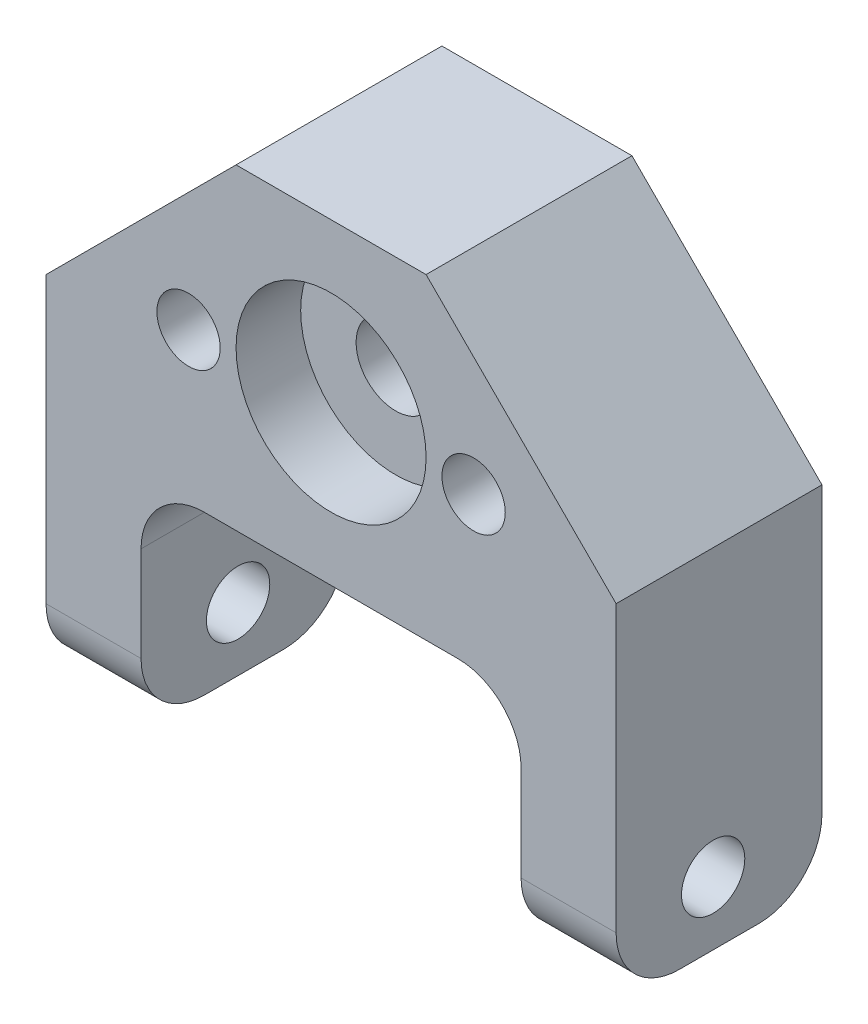
ISO-10303-21;
HEADER;
FILE_DESCRIPTION(('STEP AP214'),'2;1');
FILE_NAME('part.step','',(''),(''),'','','');
FILE_SCHEMA(('AUTOMOTIVE_DESIGN { 1 0 10303 214 1 1 1 1 }'));
ENDSEC;
DATA;
#1=APPLICATION_CONTEXT('core data for automotive mechanical design processes');
#2=APPLICATION_PROTOCOL_DEFINITION('international standard','automotive_design',2000,#1);
#3=PRODUCT_CONTEXT('',#1,'mechanical');
#4=PRODUCT('Part','Part','',(#3));
#5=PRODUCT_RELATED_PRODUCT_CATEGORY('part','',(#4));
#6=PRODUCT_DEFINITION_FORMATION('','',#4);
#7=PRODUCT_DEFINITION_CONTEXT('part definition',#1,'design');
#8=PRODUCT_DEFINITION('design','',#6,#7);
#9=PRODUCT_DEFINITION_SHAPE('','',#8);
#10=(LENGTH_UNIT() NAMED_UNIT(*) SI_UNIT(.MILLI.,.METRE.));
#11=(NAMED_UNIT(*) PLANE_ANGLE_UNIT() SI_UNIT($,.RADIAN.));
#12=(NAMED_UNIT(*) SI_UNIT($,.STERADIAN.) SOLID_ANGLE_UNIT());
#13=UNCERTAINTY_MEASURE_WITH_UNIT(LENGTH_MEASURE(1.E-05),#10,'distance_accuracy_value','');
#14=(GEOMETRIC_REPRESENTATION_CONTEXT(3) GLOBAL_UNCERTAINTY_ASSIGNED_CONTEXT((#13)) GLOBAL_UNIT_ASSIGNED_CONTEXT((#10,
#11,#12)) REPRESENTATION_CONTEXT('',''));
#15=CARTESIAN_POINT('',(0.,0.,0.));
#16=DIRECTION('',(0.,0.,1.));
#17=DIRECTION('',(1.,0.,0.));
#18=AXIS2_PLACEMENT_3D('',#15,#16,#17);
#19=CARTESIAN_POINT('',(28.575,-15.875,20.6375));
#20=DIRECTION('',(0.,1.,0.));
#21=DIRECTION('',(0.,0.,1.));
#22=AXIS2_PLACEMENT_3D('',#19,#20,#21);
#23=PLANE('',#22);
#24=DIRECTION('',(1.,0.,0.));
#25=VECTOR('',#24,1.);
#26=CARTESIAN_POINT('',(28.575,-15.875,0.));
#27=LINE('',#26,#25);
#28=CARTESIAN_POINT('',(-12.7,-15.875,0.));
#29=VERTEX_POINT('',#28);
#30=CARTESIAN_POINT('',(12.7,-15.875,0.));
#31=VERTEX_POINT('',#30);
#32=EDGE_CURVE('E241',#29,#31,#27,.T.);
#33=ORIENTED_EDGE('',*,*,#32,.T.);
#34=DIRECTION('',(0.,0.,-1.));
#35=VECTOR('',#34,1.);
#36=CARTESIAN_POINT('',(12.7,-15.875,20.6375));
#37=LINE('',#36,#35);
#38=CARTESIAN_POINT('',(12.7,-15.875,20.6375));
#39=VERTEX_POINT('',#38);
#40=EDGE_CURVE('E256',#31,#39,#37,.F.);
#41=ORIENTED_EDGE('',*,*,#40,.T.);
#42=DIRECTION('',(1.,0.,0.));
#43=VECTOR('',#42,1.);
#44=CARTESIAN_POINT('',(28.575,-15.875,20.6375));
#45=LINE('',#44,#43);
#46=CARTESIAN_POINT('',(-12.7,-15.875,20.6375));
#47=VERTEX_POINT('',#46);
#48=EDGE_CURVE('E231',#47,#39,#45,.T.);
#49=ORIENTED_EDGE('',*,*,#48,.F.);
#50=DIRECTION('',(0.,0.,1.));
#51=VECTOR('',#50,1.);
#52=CARTESIAN_POINT('',(-12.7,-15.875,0.));
#53=LINE('',#52,#51);
#54=EDGE_CURVE('E254',#47,#29,#53,.F.);
#55=ORIENTED_EDGE('',*,*,#54,.T.);
#56=EDGE_LOOP('',(#33,#41,#49,#55));
#57=FACE_BOUND('',#56,.T.);
#58=ADVANCED_FACE('F35',(#57),#23,.F.);
#59=CARTESIAN_POINT('',(-28.575,-15.875,20.6375));
#60=DIRECTION('',(1.,0.,0.));
#61=DIRECTION('',(0.,0.,-1.));
#62=AXIS2_PLACEMENT_3D('',#59,#60,#61);
#63=PLANE('',#62);
#64=CARTESIAN_POINT('',(-28.575,-31.75,10.9095205986023));
#65=DIRECTION('',(1.,0.,0.));
#66=DIRECTION('',(0.,0.,-1.));
#67=AXIS2_PLACEMENT_3D('',#64,#65,#66);
#68=CIRCLE('',#67,3.175);
#69=CARTESIAN_POINT('',(-28.575,-31.75,7.73452059860228));
#70=VERTEX_POINT('',#69);
#71=EDGE_CURVE('E177',#70,#70,#68,.T.);
#72=ORIENTED_EDGE('',*,*,#71,.T.);
#73=EDGE_LOOP('',(#72));
#74=FACE_BOUND('',#73,.T.);
#75=DIRECTION('',(0.,-1.,0.));
#76=VECTOR('',#75,1.);
#77=CARTESIAN_POINT('',(-28.575,-15.875,20.6375));
#78=LINE('',#77,#76);
#79=CARTESIAN_POINT('',(-28.575,-3.17500000000001,20.6375));
#80=VERTEX_POINT('',#79);
#81=CARTESIAN_POINT('',(-28.575,-31.75,20.6375));
#82=VERTEX_POINT('',#81);
#83=EDGE_CURVE('E229',#80,#82,#78,.T.);
#84=ORIENTED_EDGE('',*,*,#83,.F.);
#85=DIRECTION('',(0.,0.,-1.));
#86=VECTOR('',#85,1.);
#87=CARTESIAN_POINT('',(-28.575,-3.17500000000001,20.6375));
#88=LINE('',#87,#86);
#89=CARTESIAN_POINT('',(-28.575,-3.17500000000001,0.));
#90=VERTEX_POINT('',#89);
#91=EDGE_CURVE('E11',#80,#90,#88,.T.);
#92=ORIENTED_EDGE('',*,*,#91,.T.);
#93=DIRECTION('',(0.,-1.,0.));
#94=VECTOR('',#93,1.);
#95=CARTESIAN_POINT('',(-28.575,-15.875,0.));
#96=LINE('',#95,#94);
#97=CARTESIAN_POINT('',(-28.575,-31.75,0.));
#98=VERTEX_POINT('',#97);
#99=EDGE_CURVE('E226',#90,#98,#96,.T.);
#100=ORIENTED_EDGE('',*,*,#99,.T.);
#101=CARTESIAN_POINT('',(-28.575,-31.75,6.35));
#102=DIRECTION('',(1.,0.,0.));
#103=DIRECTION('',(0.,0.,-1.));
#104=AXIS2_PLACEMENT_3D('',#101,#102,#103);
#105=CIRCLE('',#104,6.35);
#106=CARTESIAN_POINT('',(-28.575,-38.1,6.35));
#107=VERTEX_POINT('',#106);
#108=EDGE_CURVE('E300',#98,#107,#105,.F.);
#109=ORIENTED_EDGE('',*,*,#108,.T.);
#110=DIRECTION('',(0.,0.,-1.));
#111=VECTOR('',#110,1.);
#112=CARTESIAN_POINT('',(-28.575,-38.1,20.6375));
#113=LINE('',#112,#111);
#114=CARTESIAN_POINT('',(-28.575,-38.1,14.2875));
#115=VERTEX_POINT('',#114);
#116=EDGE_CURVE('E196',#115,#107,#113,.T.);
#117=ORIENTED_EDGE('',*,*,#116,.F.);
#118=CARTESIAN_POINT('',(-28.575,-31.75,14.2875));
#119=DIRECTION('',(1.,0.,0.));
#120=DIRECTION('',(0.,0.,-1.));
#121=AXIS2_PLACEMENT_3D('',#118,#119,#120);
#122=CIRCLE('',#121,6.35);
#123=EDGE_CURVE('E302',#115,#82,#122,.F.);
#124=ORIENTED_EDGE('',*,*,#123,.T.);
#125=EDGE_LOOP('',(#84,#92,#100,#109,#117,#124));
#126=FACE_BOUND('',#125,.T.);
#127=ADVANCED_FACE('F376',(#74,#126),#63,.F.);
#128=CARTESIAN_POINT('',(28.575,-15.875,20.6375));
#129=DIRECTION('',(-1.,0.,0.));
#130=DIRECTION('',(0.,0.,1.));
#131=AXIS2_PLACEMENT_3D('',#128,#129,#130);
#132=PLANE('',#131);
#133=CARTESIAN_POINT('',(28.575,-31.75,10.9095205986023));
#134=DIRECTION('',(1.,0.,0.));
#135=DIRECTION('',(0.,0.,-1.));
#136=AXIS2_PLACEMENT_3D('',#133,#134,#135);
#137=CIRCLE('',#136,3.175);
#138=CARTESIAN_POINT('',(28.575,-31.75,7.73452059860228));
#139=VERTEX_POINT('',#138);
#140=EDGE_CURVE('E176',#139,#139,#137,.T.);
#141=ORIENTED_EDGE('',*,*,#140,.F.);
#142=EDGE_LOOP('',(#141));
#143=FACE_BOUND('',#142,.T.);
#144=DIRECTION('',(0.,1.,0.));
#145=VECTOR('',#144,1.);
#146=CARTESIAN_POINT('',(28.575,-15.875,0.));
#147=LINE('',#146,#145);
#148=CARTESIAN_POINT('',(28.575,-31.75,0.));
#149=VERTEX_POINT('',#148);
#150=CARTESIAN_POINT('',(28.575,-3.17500000000007,0.));
#151=VERTEX_POINT('',#150);
#152=EDGE_CURVE('E244',#149,#151,#147,.T.);
#153=ORIENTED_EDGE('',*,*,#152,.T.);
#154=DIRECTION('',(0.,0.,1.));
#155=VECTOR('',#154,1.);
#156=CARTESIAN_POINT('',(28.575,-3.17500000000007,20.6375));
#157=LINE('',#156,#155);
#158=CARTESIAN_POINT('',(28.575,-3.17500000000007,20.6375));
#159=VERTEX_POINT('',#158);
#160=EDGE_CURVE('E58',#151,#159,#157,.T.);
#161=ORIENTED_EDGE('',*,*,#160,.T.);
#162=DIRECTION('',(0.,1.,0.));
#163=VECTOR('',#162,1.);
#164=CARTESIAN_POINT('',(28.575,-15.875,20.6375));
#165=LINE('',#164,#163);
#166=CARTESIAN_POINT('',(28.575,-31.75,20.6375));
#167=VERTEX_POINT('',#166);
#168=EDGE_CURVE('E235',#167,#159,#165,.T.);
#169=ORIENTED_EDGE('',*,*,#168,.F.);
#170=CARTESIAN_POINT('',(28.575,-31.75,14.2875));
#171=DIRECTION('',(-1.,0.,0.));
#172=DIRECTION('',(0.,0.,1.));
#173=AXIS2_PLACEMENT_3D('',#170,#171,#172);
#174=CIRCLE('',#173,6.35);
#175=CARTESIAN_POINT('',(28.575,-38.1,14.2875));
#176=VERTEX_POINT('',#175);
#177=EDGE_CURVE('E277',#167,#176,#174,.F.);
#178=ORIENTED_EDGE('',*,*,#177,.T.);
#179=DIRECTION('',(0.,0.,1.));
#180=VECTOR('',#179,1.);
#181=CARTESIAN_POINT('',(28.575,-38.1,20.6375));
#182=LINE('',#181,#180);
#183=CARTESIAN_POINT('',(28.575,-38.1,6.35));
#184=VERTEX_POINT('',#183);
#185=EDGE_CURVE('E186',#184,#176,#182,.T.);
#186=ORIENTED_EDGE('',*,*,#185,.F.);
#187=CARTESIAN_POINT('',(28.575,-31.75,6.35));
#188=DIRECTION('',(-1.,0.,0.));
#189=DIRECTION('',(0.,0.,1.));
#190=AXIS2_PLACEMENT_3D('',#187,#188,#189);
#191=CIRCLE('',#190,6.35);
#192=EDGE_CURVE('E279',#184,#149,#191,.F.);
#193=ORIENTED_EDGE('',*,*,#192,.T.);
#194=EDGE_LOOP('',(#153,#161,#169,#178,#186,#193));
#195=FACE_BOUND('',#194,.T.);
#196=ADVANCED_FACE('F333',(#143,#195),#132,.F.);
#197=CARTESIAN_POINT('',(28.575,15.875,20.6375));
#198=DIRECTION('',(0.,-1.,0.));
#199=DIRECTION('',(0.,0.,-1.));
#200=AXIS2_PLACEMENT_3D('',#197,#198,#199);
#201=PLANE('',#200);
#202=DIRECTION('',(-1.,0.,0.));
#203=VECTOR('',#202,1.);
#204=CARTESIAN_POINT('',(28.575,15.875,20.6375));
#205=LINE('',#204,#203);
#206=CARTESIAN_POINT('',(9.52500000000003,15.875,20.6375));
#207=VERTEX_POINT('',#206);
#208=CARTESIAN_POINT('',(-9.52499999999989,15.875,20.6375));
#209=VERTEX_POINT('',#208);
#210=EDGE_CURVE('E237',#207,#209,#205,.T.);
#211=ORIENTED_EDGE('',*,*,#210,.F.);
#212=DIRECTION('',(0.,0.,-1.));
#213=VECTOR('',#212,1.);
#214=CARTESIAN_POINT('',(9.52500000000003,15.875,20.6375));
#215=LINE('',#214,#213);
#216=CARTESIAN_POINT('',(9.52500000000003,15.875,0.));
#217=VERTEX_POINT('',#216);
#218=EDGE_CURVE('E311',#207,#217,#215,.T.);
#219=ORIENTED_EDGE('',*,*,#218,.T.);
#220=DIRECTION('',(-1.,0.,0.));
#221=VECTOR('',#220,1.);
#222=CARTESIAN_POINT('',(28.575,15.875,0.));
#223=LINE('',#222,#221);
#224=CARTESIAN_POINT('',(-9.52499999999989,15.875,0.));
#225=VERTEX_POINT('',#224);
#226=EDGE_CURVE('E232',#217,#225,#223,.T.);
#227=ORIENTED_EDGE('',*,*,#226,.T.);
#228=DIRECTION('',(0.,0.,1.));
#229=VECTOR('',#228,1.);
#230=CARTESIAN_POINT('',(-9.52499999999989,15.875,20.6375));
#231=LINE('',#230,#229);
#232=EDGE_CURVE('E309',#225,#209,#231,.T.);
#233=ORIENTED_EDGE('',*,*,#232,.T.);
#234=EDGE_LOOP('',(#211,#219,#227,#233));
#235=FACE_BOUND('',#234,.T.);
#236=ADVANCED_FACE('F325',(#235),#201,.F.);
#237=CARTESIAN_POINT('',(0.,0.,20.6375));
#238=DIRECTION('',(0.,0.,1.));
#239=DIRECTION('',(1.,0.,0.));
#240=AXIS2_PLACEMENT_3D('',#237,#238,#239);
#241=PLANE('',#240);
#242=CARTESIAN_POINT('',(-14.2875728668612,-0.825499999999172,20.6375));
#243=DIRECTION('',(0.,0.,1.));
#244=DIRECTION('',(1.,0.,0.));
#245=AXIS2_PLACEMENT_3D('',#242,#243,#244);
#246=CIRCLE('',#245,3.17499999999999);
#247=CARTESIAN_POINT('',(-11.1125728668612,-0.825499999999172,20.6375));
#248=VERTEX_POINT('',#247);
#249=EDGE_CURVE('E166',#248,#248,#246,.T.);
#250=ORIENTED_EDGE('',*,*,#249,.F.);
#251=EDGE_LOOP('',(#250));
#252=FACE_BOUND('',#251,.T.);
#253=CARTESIAN_POINT('',(14.2874270219863,-0.828020390614769,20.6375));
#254=DIRECTION('',(0.,0.,1.));
#255=DIRECTION('',(1.,0.,0.));
#256=AXIS2_PLACEMENT_3D('',#253,#254,#255);
#257=CIRCLE('',#256,3.17499999999999);
#258=CARTESIAN_POINT('',(17.4624270219863,-0.828020390614769,20.6375));
#259=VERTEX_POINT('',#258);
#260=EDGE_CURVE('E165',#259,#259,#257,.T.);
#261=ORIENTED_EDGE('',*,*,#260,.F.);
#262=EDGE_LOOP('',(#261));
#263=FACE_BOUND('',#262,.T.);
#264=CARTESIAN_POINT('',(0.,0.,20.6375));
#265=DIRECTION('',(0.,0.,-1.));
#266=DIRECTION('',(-1.,0.,0.));
#267=AXIS2_PLACEMENT_3D('',#264,#265,#266);
#268=CIRCLE('',#267,9.525);
#269=CARTESIAN_POINT('',(-9.525,0.,20.6375));
#270=VERTEX_POINT('',#269);
#271=EDGE_CURVE('E207',#270,#270,#268,.T.);
#272=ORIENTED_EDGE('',*,*,#271,.T.);
#273=EDGE_LOOP('',(#272));
#274=FACE_BOUND('',#273,.T.);
#275=ORIENTED_EDGE('',*,*,#168,.T.);
#276=DIRECTION('',(0.707106781186546,-0.707106781186549,0.));
#277=VECTOR('',#276,1.);
#278=CARTESIAN_POINT('',(12.7,12.7,20.6375));
#279=LINE('',#278,#277);
#280=EDGE_CURVE('E43',#159,#207,#279,.F.);
#281=ORIENTED_EDGE('',*,*,#280,.T.);
#282=ORIENTED_EDGE('',*,*,#210,.T.);
#283=DIRECTION('',(0.707106781186549,0.707106781186546,0.));
#284=VECTOR('',#283,1.);
#285=CARTESIAN_POINT('',(-12.6999999999999,12.7,20.6375));
#286=LINE('',#285,#284);
#287=EDGE_CURVE('E50',#209,#80,#286,.F.);
#288=ORIENTED_EDGE('',*,*,#287,.T.);
#289=ORIENTED_EDGE('',*,*,#83,.T.);
#290=DIRECTION('',(-1.,0.,0.));
#291=VECTOR('',#290,1.);
#292=CARTESIAN_POINT('',(0.,-31.75,20.6375));
#293=LINE('',#292,#291);
#294=CARTESIAN_POINT('',(-19.05,-31.75,20.6375));
#295=VERTEX_POINT('',#294);
#296=EDGE_CURVE('E290',#82,#295,#293,.F.);
#297=ORIENTED_EDGE('',*,*,#296,.T.);
#298=DIRECTION('',(0.,1.,0.));
#299=VECTOR('',#298,1.);
#300=CARTESIAN_POINT('',(-19.05,-38.1,20.6375));
#301=LINE('',#300,#299);
#302=CARTESIAN_POINT('',(-19.05,-22.225,20.6375));
#303=VERTEX_POINT('',#302);
#304=EDGE_CURVE('E202',#295,#303,#301,.T.);
#305=ORIENTED_EDGE('',*,*,#304,.T.);
#306=CARTESIAN_POINT('',(-12.7,-22.225,20.6375));
#307=DIRECTION('',(0.,0.,1.));
#308=DIRECTION('',(1.,0.,0.));
#309=AXIS2_PLACEMENT_3D('',#306,#307,#308);
#310=CIRCLE('',#309,6.35);
#311=EDGE_CURVE('E266',#303,#47,#310,.F.);
#312=ORIENTED_EDGE('',*,*,#311,.T.);
#313=ORIENTED_EDGE('',*,*,#48,.T.);
#314=CARTESIAN_POINT('',(12.7,-22.225,20.6375));
#315=DIRECTION('',(0.,0.,1.));
#316=DIRECTION('',(1.,0.,0.));
#317=AXIS2_PLACEMENT_3D('',#314,#315,#316);
#318=CIRCLE('',#317,6.35);
#319=CARTESIAN_POINT('',(19.05,-22.225,20.6375));
#320=VERTEX_POINT('',#319);
#321=EDGE_CURVE('E263',#39,#320,#318,.F.);
#322=ORIENTED_EDGE('',*,*,#321,.T.);
#323=DIRECTION('',(0.,1.,0.));
#324=VECTOR('',#323,1.);
#325=CARTESIAN_POINT('',(19.05,-38.1,20.6375));
#326=LINE('',#325,#324);
#327=CARTESIAN_POINT('',(19.05,-31.75,20.6375));
#328=VERTEX_POINT('',#327);
#329=EDGE_CURVE('E194',#328,#320,#326,.T.);
#330=ORIENTED_EDGE('',*,*,#329,.F.);
#331=DIRECTION('',(-1.,0.,0.));
#332=VECTOR('',#331,1.);
#333=CARTESIAN_POINT('',(28.575,-31.75,20.6375));
#334=LINE('',#333,#332);
#335=EDGE_CURVE('E292',#328,#167,#334,.F.);
#336=ORIENTED_EDGE('',*,*,#335,.T.);
#337=EDGE_LOOP('',(#275,#281,#282,#288,#289,#297,#305,#312,#313,#322,#330,#336));
#338=FACE_BOUND('',#337,.T.);
#339=ADVANCED_FACE('F321',(#252,#263,#274,#338),#241,.T.);
#340=CARTESIAN_POINT('',(0.,0.,0.));
#341=DIRECTION('',(0.,0.,1.));
#342=DIRECTION('',(1.,0.,0.));
#343=AXIS2_PLACEMENT_3D('',#340,#341,#342);
#344=PLANE('',#343);
#345=CARTESIAN_POINT('',(0.,0.,0.));
#346=DIRECTION('',(0.,0.,-1.));
#347=DIRECTION('',(-1.,0.,0.));
#348=AXIS2_PLACEMENT_3D('',#345,#346,#347);
#349=CIRCLE('',#348,11.1125);
#350=CARTESIAN_POINT('',(-11.1125,0.,0.));
#351=VERTEX_POINT('',#350);
#352=EDGE_CURVE('E220',#351,#351,#349,.T.);
#353=ORIENTED_EDGE('',*,*,#352,.F.);
#354=EDGE_LOOP('',(#353));
#355=FACE_BOUND('',#354,.T.);
#356=ORIENTED_EDGE('',*,*,#226,.F.);
#357=DIRECTION('',(-0.707106781186546,0.707106781186549,0.));
#358=VECTOR('',#357,1.);
#359=CARTESIAN_POINT('',(9.52500000000003,15.875,0.));
#360=LINE('',#359,#358);
#361=EDGE_CURVE('E316',#217,#151,#360,.F.);
#362=ORIENTED_EDGE('',*,*,#361,.T.);
#363=ORIENTED_EDGE('',*,*,#152,.F.);
#364=DIRECTION('',(1.,0.,0.));
#365=VECTOR('',#364,1.);
#366=CARTESIAN_POINT('',(0.,-31.75,0.));
#367=LINE('',#366,#365);
#368=CARTESIAN_POINT('',(19.05,-31.75,0.));
#369=VERTEX_POINT('',#368);
#370=EDGE_CURVE('E284',#149,#369,#367,.F.);
#371=ORIENTED_EDGE('',*,*,#370,.T.);
#372=DIRECTION('',(0.,1.,0.));
#373=VECTOR('',#372,1.);
#374=CARTESIAN_POINT('',(19.05,-38.1,0.));
#375=LINE('',#374,#373);
#376=CARTESIAN_POINT('',(19.05,-22.225,0.));
#377=VERTEX_POINT('',#376);
#378=EDGE_CURVE('E192',#369,#377,#375,.T.);
#379=ORIENTED_EDGE('',*,*,#378,.T.);
#380=CARTESIAN_POINT('',(12.7,-22.225,0.));
#381=DIRECTION('',(0.,0.,1.));
#382=DIRECTION('',(1.,0.,0.));
#383=AXIS2_PLACEMENT_3D('',#380,#381,#382);
#384=CIRCLE('',#383,6.35);
#385=EDGE_CURVE('E261',#377,#31,#384,.T.);
#386=ORIENTED_EDGE('',*,*,#385,.T.);
#387=ORIENTED_EDGE('',*,*,#32,.F.);
#388=CARTESIAN_POINT('',(-12.7,-22.225,0.));
#389=DIRECTION('',(0.,0.,1.));
#390=DIRECTION('',(1.,0.,0.));
#391=AXIS2_PLACEMENT_3D('',#388,#389,#390);
#392=CIRCLE('',#391,6.35);
#393=CARTESIAN_POINT('',(-19.05,-22.225,0.));
#394=VERTEX_POINT('',#393);
#395=EDGE_CURVE('E268',#29,#394,#392,.T.);
#396=ORIENTED_EDGE('',*,*,#395,.T.);
#397=DIRECTION('',(0.,1.,0.));
#398=VECTOR('',#397,1.);
#399=CARTESIAN_POINT('',(-19.05,-38.1,0.));
#400=LINE('',#399,#398);
#401=CARTESIAN_POINT('',(-19.05,-31.75,0.));
#402=VERTEX_POINT('',#401);
#403=EDGE_CURVE('E204',#402,#394,#400,.T.);
#404=ORIENTED_EDGE('',*,*,#403,.F.);
#405=DIRECTION('',(1.,0.,0.));
#406=VECTOR('',#405,1.);
#407=CARTESIAN_POINT('',(-28.575,-31.75,0.));
#408=LINE('',#407,#406);
#409=EDGE_CURVE('E281',#402,#98,#408,.F.);
#410=ORIENTED_EDGE('',*,*,#409,.T.);
#411=ORIENTED_EDGE('',*,*,#99,.F.);
#412=DIRECTION('',(-0.707106781186549,-0.707106781186546,0.));
#413=VECTOR('',#412,1.);
#414=CARTESIAN_POINT('',(-28.575,-3.17500000000001,0.));
#415=LINE('',#414,#413);
#416=EDGE_CURVE('E314',#90,#225,#415,.F.);
#417=ORIENTED_EDGE('',*,*,#416,.T.);
#418=EDGE_LOOP('',(#356,#362,#363,#371,#379,#386,#387,#396,#404,#410,#411,#417));
#419=FACE_BOUND('',#418,.T.);
#420=ADVANCED_FACE('F331',(#355,#419),#344,.F.);
#421=CARTESIAN_POINT('',(0.,0.,6.985));
#422=DIRECTION('',(0.,0.,-1.));
#423=DIRECTION('',(-1.,0.,0.));
#424=AXIS2_PLACEMENT_3D('',#421,#422,#423);
#425=CYLINDRICAL_SURFACE('',#424,11.1125);
#426=CARTESIAN_POINT('',(0.,0.,6.985));
#427=DIRECTION('',(0.,0.,-1.));
#428=DIRECTION('',(-1.,0.,0.));
#429=AXIS2_PLACEMENT_3D('',#426,#427,#428);
#430=CIRCLE('',#429,11.1125);
#431=CARTESIAN_POINT('',(-11.1125,0.,6.985));
#432=VERTEX_POINT('',#431);
#433=EDGE_CURVE('E223',#432,#432,#430,.T.);
#434=ORIENTED_EDGE('',*,*,#433,.F.);
#435=EDGE_LOOP('',(#434));
#436=FACE_BOUND('',#435,.T.);
#437=ORIENTED_EDGE('',*,*,#352,.T.);
#438=EDGE_LOOP('',(#437));
#439=FACE_BOUND('',#438,.T.);
#440=ADVANCED_FACE('F436',(#436,#439),#425,.F.);
#441=CARTESIAN_POINT('',(0.,0.,6.985));
#442=DIRECTION('',(0.,0.,-1.));
#443=DIRECTION('',(-1.,0.,0.));
#444=AXIS2_PLACEMENT_3D('',#441,#442,#443);
#445=PLANE('',#444);
#446=CARTESIAN_POINT('',(0.,0.,6.985));
#447=DIRECTION('',(0.,0.,-1.));
#448=DIRECTION('',(-1.,0.,0.));
#449=AXIS2_PLACEMENT_3D('',#446,#447,#448);
#450=CIRCLE('',#449,8.255);
#451=CARTESIAN_POINT('',(-8.255,0.,6.985));
#452=VERTEX_POINT('',#451);
#453=EDGE_CURVE('E216',#452,#452,#450,.T.);
#454=ORIENTED_EDGE('',*,*,#453,.F.);
#455=EDGE_LOOP('',(#454));
#456=FACE_BOUND('',#455,.T.);
#457=ORIENTED_EDGE('',*,*,#433,.T.);
#458=EDGE_LOOP('',(#457));
#459=FACE_BOUND('',#458,.T.);
#460=ADVANCED_FACE('F529',(#456,#459),#445,.T.);
#461=CARTESIAN_POINT('',(0.,0.,9.398));
#462=DIRECTION('',(0.,0.,-1.));
#463=DIRECTION('',(-1.,0.,0.));
#464=AXIS2_PLACEMENT_3D('',#461,#462,#463);
#465=CYLINDRICAL_SURFACE('',#464,8.255);
#466=CARTESIAN_POINT('',(0.,0.,9.398));
#467=DIRECTION('',(0.,0.,-1.));
#468=DIRECTION('',(-1.,0.,0.));
#469=AXIS2_PLACEMENT_3D('',#466,#467,#468);
#470=CIRCLE('',#469,8.255);
#471=CARTESIAN_POINT('',(-8.255,0.,9.398));
#472=VERTEX_POINT('',#471);
#473=EDGE_CURVE('E217',#472,#472,#470,.T.);
#474=ORIENTED_EDGE('',*,*,#473,.F.);
#475=EDGE_LOOP('',(#474));
#476=FACE_BOUND('',#475,.T.);
#477=ORIENTED_EDGE('',*,*,#453,.T.);
#478=EDGE_LOOP('',(#477));
#479=FACE_BOUND('',#478,.T.);
#480=ADVANCED_FACE('F520',(#476,#479),#465,.F.);
#481=CARTESIAN_POINT('',(0.,0.,9.398));
#482=DIRECTION('',(0.,0.,-1.));
#483=DIRECTION('',(-1.,0.,0.));
#484=AXIS2_PLACEMENT_3D('',#481,#482,#483);
#485=PLANE('',#484);
#486=CARTESIAN_POINT('',(0.,0.,9.398));
#487=DIRECTION('',(0.,0.,-1.));
#488=DIRECTION('',(-1.,0.,0.));
#489=AXIS2_PLACEMENT_3D('',#486,#487,#488);
#490=CIRCLE('',#489,3.96875);
#491=CARTESIAN_POINT('',(-3.96875,0.,9.398));
#492=VERTEX_POINT('',#491);
#493=EDGE_CURVE('E213',#492,#492,#490,.T.);
#494=ORIENTED_EDGE('',*,*,#493,.F.);
#495=EDGE_LOOP('',(#494));
#496=FACE_BOUND('',#495,.T.);
#497=ORIENTED_EDGE('',*,*,#473,.T.);
#498=EDGE_LOOP('',(#497));
#499=FACE_BOUND('',#498,.T.);
#500=ADVANCED_FACE('F511',(#496,#499),#485,.T.);
#501=CARTESIAN_POINT('',(0.,0.,20.6375));
#502=DIRECTION('',(0.,0.,-1.));
#503=DIRECTION('',(-1.,0.,0.));
#504=AXIS2_PLACEMENT_3D('',#501,#502,#503);
#505=CYLINDRICAL_SURFACE('',#504,3.96875);
#506=CARTESIAN_POINT('',(0.,0.,14.1605));
#507=DIRECTION('',(0.,0.,-1.));
#508=DIRECTION('',(-1.,0.,0.));
#509=AXIS2_PLACEMENT_3D('',#506,#507,#508);
#510=CIRCLE('',#509,3.96875);
#511=CARTESIAN_POINT('',(-3.96875,0.,14.1605));
#512=VERTEX_POINT('',#511);
#513=EDGE_CURVE('E210',#512,#512,#510,.F.);
#514=ORIENTED_EDGE('',*,*,#513,.T.);
#515=EDGE_LOOP('',(#514));
#516=FACE_BOUND('',#515,.T.);
#517=ORIENTED_EDGE('',*,*,#493,.T.);
#518=EDGE_LOOP('',(#517));
#519=FACE_BOUND('',#518,.T.);
#520=ADVANCED_FACE('F502',(#516,#519),#505,.F.);
#521=CARTESIAN_POINT('',(0.,0.,14.1605));
#522=DIRECTION('',(0.,0.,-1.));
#523=DIRECTION('',(-1.,0.,0.));
#524=AXIS2_PLACEMENT_3D('',#521,#522,#523);
#525=PLANE('',#524);
#526=CARTESIAN_POINT('',(0.,0.,14.1605));
#527=DIRECTION('',(0.,0.,-1.));
#528=DIRECTION('',(-1.,0.,0.));
#529=AXIS2_PLACEMENT_3D('',#526,#527,#528);
#530=CIRCLE('',#529,9.525);
#531=CARTESIAN_POINT('',(-9.525,0.,14.1605));
#532=VERTEX_POINT('',#531);
#533=EDGE_CURVE('E206',#532,#532,#530,.T.);
#534=ORIENTED_EDGE('',*,*,#533,.F.);
#535=EDGE_LOOP('',(#534));
#536=FACE_BOUND('',#535,.T.);
#537=ORIENTED_EDGE('',*,*,#513,.F.);
#538=EDGE_LOOP('',(#537));
#539=FACE_BOUND('',#538,.T.);
#540=ADVANCED_FACE('F492',(#536,#539),#525,.F.);
#541=CARTESIAN_POINT('',(0.,0.,20.6375));
#542=DIRECTION('',(0.,0.,-1.));
#543=DIRECTION('',(-1.,0.,0.));
#544=AXIS2_PLACEMENT_3D('',#541,#542,#543);
#545=CYLINDRICAL_SURFACE('',#544,9.525);
#546=ORIENTED_EDGE('',*,*,#271,.F.);
#547=EDGE_LOOP('',(#546));
#548=FACE_BOUND('',#547,.T.);
#549=ORIENTED_EDGE('',*,*,#533,.T.);
#550=EDGE_LOOP('',(#549));
#551=FACE_BOUND('',#550,.T.);
#552=ADVANCED_FACE('F486',(#548,#551),#545,.F.);
#553=CARTESIAN_POINT('',(-19.05,-38.1,20.6375));
#554=DIRECTION('',(-1.,0.,0.));
#555=DIRECTION('',(0.,-1.,0.));
#556=AXIS2_PLACEMENT_3D('',#553,#554,#555);
#557=PLANE('',#556);
#558=CARTESIAN_POINT('',(-19.05,-31.75,10.9095205986023));
#559=DIRECTION('',(-1.,0.,0.));
#560=DIRECTION('',(0.,-1.,0.));
#561=AXIS2_PLACEMENT_3D('',#558,#559,#560);
#562=CIRCLE('',#561,3.175);
#563=CARTESIAN_POINT('',(-19.05,-34.925,10.9095205986023));
#564=VERTEX_POINT('',#563);
#565=EDGE_CURVE('E183',#564,#564,#562,.T.);
#566=ORIENTED_EDGE('',*,*,#565,.T.);
#567=EDGE_LOOP('',(#566));
#568=FACE_BOUND('',#567,.T.);
#569=ORIENTED_EDGE('',*,*,#304,.F.);
#570=CARTESIAN_POINT('',(-19.05,-31.75,14.2875));
#571=DIRECTION('',(-1.,0.,0.));
#572=DIRECTION('',(0.,-1.,0.));
#573=AXIS2_PLACEMENT_3D('',#570,#571,#572);
#574=CIRCLE('',#573,6.35);
#575=CARTESIAN_POINT('',(-19.05,-38.1,14.2875));
#576=VERTEX_POINT('',#575);
#577=EDGE_CURVE('E307',#295,#576,#574,.F.);
#578=ORIENTED_EDGE('',*,*,#577,.T.);
#579=DIRECTION('',(0.,0.,1.));
#580=VECTOR('',#579,1.);
#581=CARTESIAN_POINT('',(-19.05,-38.1,20.6375));
#582=LINE('',#581,#580);
#583=CARTESIAN_POINT('',(-19.05,-38.1,6.35));
#584=VERTEX_POINT('',#583);
#585=EDGE_CURVE('E199',#584,#576,#582,.T.);
#586=ORIENTED_EDGE('',*,*,#585,.F.);
#587=CARTESIAN_POINT('',(-19.05,-31.75,6.35));
#588=DIRECTION('',(-1.,0.,0.));
#589=DIRECTION('',(0.,-1.,0.));
#590=AXIS2_PLACEMENT_3D('',#587,#588,#589);
#591=CIRCLE('',#590,6.35);
#592=EDGE_CURVE('E305',#584,#402,#591,.F.);
#593=ORIENTED_EDGE('',*,*,#592,.T.);
#594=ORIENTED_EDGE('',*,*,#403,.T.);
#595=DIRECTION('',(0.,0.,1.));
#596=VECTOR('',#595,1.);
#597=CARTESIAN_POINT('',(-19.05,-22.225,20.6375));
#598=LINE('',#597,#596);
#599=EDGE_CURVE('E258',#394,#303,#598,.T.);
#600=ORIENTED_EDGE('',*,*,#599,.T.);
#601=EDGE_LOOP('',(#569,#578,#586,#593,#594,#600));
#602=FACE_BOUND('',#601,.T.);
#603=ADVANCED_FACE('F364',(#568,#602),#557,.F.);
#604=CARTESIAN_POINT('',(0.,-38.1,0.));
#605=DIRECTION('',(0.,-1.,0.));
#606=DIRECTION('',(1.,0.,0.));
#607=AXIS2_PLACEMENT_3D('',#604,#605,#606);
#608=PLANE('',#607);
#609=ORIENTED_EDGE('',*,*,#585,.T.);
#610=DIRECTION('',(-1.,0.,0.));
#611=VECTOR('',#610,1.);
#612=CARTESIAN_POINT('',(0.,-38.1,14.2875));
#613=LINE('',#612,#611);
#614=EDGE_CURVE('E297',#576,#115,#613,.T.);
#615=ORIENTED_EDGE('',*,*,#614,.T.);
#616=ORIENTED_EDGE('',*,*,#116,.T.);
#617=DIRECTION('',(1.,0.,0.));
#618=VECTOR('',#617,1.);
#619=CARTESIAN_POINT('',(-19.05,-38.1,6.35));
#620=LINE('',#619,#618);
#621=EDGE_CURVE('E294',#107,#584,#620,.T.);
#622=ORIENTED_EDGE('',*,*,#621,.T.);
#623=EDGE_LOOP('',(#609,#615,#616,#622));
#624=FACE_BOUND('',#623,.T.);
#625=ADVANCED_FACE('F378',(#624),#608,.T.);
#626=CARTESIAN_POINT('',(19.05,-38.1,20.6375));
#627=DIRECTION('',(1.,0.,0.));
#628=DIRECTION('',(0.,1.,0.));
#629=AXIS2_PLACEMENT_3D('',#626,#627,#628);
#630=PLANE('',#629);
#631=CARTESIAN_POINT('',(19.05,-31.75,10.9095205986023));
#632=DIRECTION('',(1.,0.,0.));
#633=DIRECTION('',(0.,1.,0.));
#634=AXIS2_PLACEMENT_3D('',#631,#632,#633);
#635=CIRCLE('',#634,3.175);
#636=CARTESIAN_POINT('',(19.05,-28.575,10.9095205986023));
#637=VERTEX_POINT('',#636);
#638=EDGE_CURVE('E180',#637,#637,#635,.T.);
#639=ORIENTED_EDGE('',*,*,#638,.T.);
#640=EDGE_LOOP('',(#639));
#641=FACE_BOUND('',#640,.T.);
#642=ORIENTED_EDGE('',*,*,#378,.F.);
#643=CARTESIAN_POINT('',(19.05,-31.75,6.35));
#644=DIRECTION('',(1.,0.,0.));
#645=DIRECTION('',(0.,1.,0.));
#646=AXIS2_PLACEMENT_3D('',#643,#644,#645);
#647=CIRCLE('',#646,6.35);
#648=CARTESIAN_POINT('',(19.05,-38.1,6.35));
#649=VERTEX_POINT('',#648);
#650=EDGE_CURVE('E288',#369,#649,#647,.F.);
#651=ORIENTED_EDGE('',*,*,#650,.T.);
#652=DIRECTION('',(0.,0.,-1.));
#653=VECTOR('',#652,1.);
#654=CARTESIAN_POINT('',(19.05,-38.1,20.6375));
#655=LINE('',#654,#653);
#656=CARTESIAN_POINT('',(19.05,-38.1,14.2875));
#657=VERTEX_POINT('',#656);
#658=EDGE_CURVE('E189',#657,#649,#655,.T.);
#659=ORIENTED_EDGE('',*,*,#658,.F.);
#660=CARTESIAN_POINT('',(19.05,-31.75,14.2875));
#661=DIRECTION('',(1.,0.,0.));
#662=DIRECTION('',(0.,1.,0.));
#663=AXIS2_PLACEMENT_3D('',#660,#661,#662);
#664=CIRCLE('',#663,6.35);
#665=EDGE_CURVE('E286',#657,#328,#664,.F.);
#666=ORIENTED_EDGE('',*,*,#665,.T.);
#667=ORIENTED_EDGE('',*,*,#329,.T.);
#668=DIRECTION('',(0.,0.,-1.));
#669=VECTOR('',#668,1.);
#670=CARTESIAN_POINT('',(19.05,-22.225,0.));
#671=LINE('',#670,#669);
#672=EDGE_CURVE('E239',#320,#377,#671,.T.);
#673=ORIENTED_EDGE('',*,*,#672,.T.);
#674=EDGE_LOOP('',(#642,#651,#659,#666,#667,#673));
#675=FACE_BOUND('',#674,.T.);
#676=ADVANCED_FACE('F345',(#641,#675),#630,.F.);
#677=CARTESIAN_POINT('',(0.,-38.1,0.));
#678=DIRECTION('',(0.,1.,0.));
#679=DIRECTION('',(-1.,0.,0.));
#680=AXIS2_PLACEMENT_3D('',#677,#678,#679);
#681=PLANE('',#680);
#682=ORIENTED_EDGE('',*,*,#658,.T.);
#683=DIRECTION('',(1.,0.,0.));
#684=VECTOR('',#683,1.);
#685=CARTESIAN_POINT('',(0.,-38.1,6.35));
#686=LINE('',#685,#684);
#687=EDGE_CURVE('E274',#649,#184,#686,.T.);
#688=ORIENTED_EDGE('',*,*,#687,.T.);
#689=ORIENTED_EDGE('',*,*,#185,.T.);
#690=DIRECTION('',(-1.,0.,0.));
#691=VECTOR('',#690,1.);
#692=CARTESIAN_POINT('',(19.05,-38.1,14.2875));
#693=LINE('',#692,#691);
#694=EDGE_CURVE('E271',#176,#657,#693,.T.);
#695=ORIENTED_EDGE('',*,*,#694,.T.);
#696=EDGE_LOOP('',(#682,#688,#689,#695));
#697=FACE_BOUND('',#696,.T.);
#698=ADVANCED_FACE('F340',(#697),#681,.F.);
#699=CARTESIAN_POINT('',(-28.575,-31.75,10.9095205986023));
#700=DIRECTION('',(1.,0.,0.));
#701=DIRECTION('',(0.,0.,-1.));
#702=AXIS2_PLACEMENT_3D('',#699,#700,#701);
#703=CYLINDRICAL_SURFACE('',#702,3.175);
#704=ORIENTED_EDGE('',*,*,#140,.T.);
#705=EDGE_LOOP('',(#704));
#706=FACE_BOUND('',#705,.T.);
#707=ORIENTED_EDGE('',*,*,#638,.F.);
#708=EDGE_LOOP('',(#707));
#709=FACE_BOUND('',#708,.T.);
#710=ADVANCED_FACE('F587',(#706,#709),#703,.F.);
#711=ORIENTED_EDGE('',*,*,#71,.F.);
#712=EDGE_LOOP('',(#711));
#713=FACE_BOUND('',#712,.T.);
#714=ORIENTED_EDGE('',*,*,#565,.F.);
#715=EDGE_LOOP('',(#714));
#716=FACE_BOUND('',#715,.T.);
#717=ADVANCED_FACE('F401',(#713,#716),#703,.F.);
#718=CARTESIAN_POINT('',(12.7,-22.225,20.6375));
#719=DIRECTION('',(0.,0.,1.));
#720=DIRECTION('',(1.,0.,0.));
#721=AXIS2_PLACEMENT_3D('',#718,#719,#720);
#722=CYLINDRICAL_SURFACE('',#721,6.35);
#723=ORIENTED_EDGE('',*,*,#321,.F.);
#724=ORIENTED_EDGE('',*,*,#40,.F.);
#725=ORIENTED_EDGE('',*,*,#385,.F.);
#726=ORIENTED_EDGE('',*,*,#672,.F.);
#727=EDGE_LOOP('',(#723,#724,#725,#726));
#728=FACE_BOUND('',#727,.T.);
#729=ADVANCED_FACE('F353',(#728),#722,.F.);
#730=CARTESIAN_POINT('',(-12.7,-22.225,20.6375));
#731=DIRECTION('',(0.,0.,-1.));
#732=DIRECTION('',(-1.,0.,0.));
#733=AXIS2_PLACEMENT_3D('',#730,#731,#732);
#734=CYLINDRICAL_SURFACE('',#733,6.35);
#735=ORIENTED_EDGE('',*,*,#395,.F.);
#736=ORIENTED_EDGE('',*,*,#54,.F.);
#737=ORIENTED_EDGE('',*,*,#311,.F.);
#738=ORIENTED_EDGE('',*,*,#599,.F.);
#739=EDGE_LOOP('',(#735,#736,#737,#738));
#740=FACE_BOUND('',#739,.T.);
#741=ADVANCED_FACE('F362',(#740),#734,.F.);
#742=CARTESIAN_POINT('',(14.2874270219863,-0.828020390614769,11.1125));
#743=DIRECTION('',(0.,0.,1.));
#744=DIRECTION('',(1.,0.,0.));
#745=AXIS2_PLACEMENT_3D('',#742,#743,#744);
#746=CONICAL_SURFACE('',#745,3.175,1.02974425867665);
#747=CARTESIAN_POINT('',(14.2874270219863,-0.828020390614769,9.2047675345875));
#748=VERTEX_POINT('',#747);
#749=VERTEX_LOOP('',#748);
#750=FACE_BOUND('',#749,.T.);
#751=CARTESIAN_POINT('',(14.2874270219863,-0.828020390614769,11.1125));
#752=DIRECTION('',(0.,0.,1.));
#753=DIRECTION('',(1.,0.,0.));
#754=AXIS2_PLACEMENT_3D('',#751,#752,#753);
#755=CIRCLE('',#754,3.175);
#756=CARTESIAN_POINT('',(17.4624270219863,-0.828020390614769,11.1125));
#757=VERTEX_POINT('',#756);
#758=EDGE_CURVE('E169',#757,#757,#755,.T.);
#759=ORIENTED_EDGE('',*,*,#758,.T.);
#760=EDGE_LOOP('',(#759));
#761=FACE_BOUND('',#760,.T.);
#762=ADVANCED_FACE('F404',(#750,#761),#746,.F.);
#763=CARTESIAN_POINT('',(14.2874270219863,-0.828020390614769,20.6375));
#764=DIRECTION('',(0.,0.,1.));
#765=DIRECTION('',(1.,0.,0.));
#766=AXIS2_PLACEMENT_3D('',#763,#764,#765);
#767=CYLINDRICAL_SURFACE('',#766,3.17499999999999);
#768=ORIENTED_EDGE('',*,*,#758,.F.);
#769=EDGE_LOOP('',(#768));
#770=FACE_BOUND('',#769,.T.);
#771=ORIENTED_EDGE('',*,*,#260,.T.);
#772=EDGE_LOOP('',(#771));
#773=FACE_BOUND('',#772,.T.);
#774=ADVANCED_FACE('F159',(#770,#773),#767,.F.);
#775=CARTESIAN_POINT('',(-14.2875728668612,-0.825499999999172,11.1125));
#776=DIRECTION('',(0.,0.,1.));
#777=DIRECTION('',(1.,0.,0.));
#778=AXIS2_PLACEMENT_3D('',#775,#776,#777);
#779=CONICAL_SURFACE('',#778,3.175,1.02974425867665);
#780=CARTESIAN_POINT('',(-14.2875728668612,-0.825499999999172,9.2047675345875));
#781=VERTEX_POINT('',#780);
#782=VERTEX_LOOP('',#781);
#783=FACE_BOUND('',#782,.T.);
#784=CARTESIAN_POINT('',(-14.2875728668612,-0.825499999999172,11.1125));
#785=DIRECTION('',(0.,0.,1.));
#786=DIRECTION('',(1.,0.,0.));
#787=AXIS2_PLACEMENT_3D('',#784,#785,#786);
#788=CIRCLE('',#787,3.175);
#789=CARTESIAN_POINT('',(-11.1125728668612,-0.825499999999172,11.1125));
#790=VERTEX_POINT('',#789);
#791=EDGE_CURVE('E163',#790,#790,#788,.T.);
#792=ORIENTED_EDGE('',*,*,#791,.T.);
#793=EDGE_LOOP('',(#792));
#794=FACE_BOUND('',#793,.T.);
#795=ADVANCED_FACE('F155',(#783,#794),#779,.F.);
#796=CARTESIAN_POINT('',(-14.2875728668612,-0.825499999999172,20.6375));
#797=DIRECTION('',(0.,0.,1.));
#798=DIRECTION('',(1.,0.,0.));
#799=AXIS2_PLACEMENT_3D('',#796,#797,#798);
#800=CYLINDRICAL_SURFACE('',#799,3.17499999999999);
#801=ORIENTED_EDGE('',*,*,#791,.F.);
#802=EDGE_LOOP('',(#801));
#803=FACE_BOUND('',#802,.T.);
#804=ORIENTED_EDGE('',*,*,#249,.T.);
#805=EDGE_LOOP('',(#804));
#806=FACE_BOUND('',#805,.T.);
#807=ADVANCED_FACE('F158',(#803,#806),#800,.F.);
#808=CARTESIAN_POINT('',(0.,-31.75,6.35));
#809=DIRECTION('',(1.,0.,0.));
#810=DIRECTION('',(0.,1.,0.));
#811=AXIS2_PLACEMENT_3D('',#808,#809,#810);
#812=CYLINDRICAL_SURFACE('',#811,6.35);
#813=ORIENTED_EDGE('',*,*,#650,.F.);
#814=ORIENTED_EDGE('',*,*,#370,.F.);
#815=ORIENTED_EDGE('',*,*,#192,.F.);
#816=ORIENTED_EDGE('',*,*,#687,.F.);
#817=EDGE_LOOP('',(#813,#814,#815,#816));
#818=FACE_BOUND('',#817,.T.);
#819=ADVANCED_FACE('F338',(#818),#812,.T.);
#820=CARTESIAN_POINT('',(0.,-31.75,14.2875));
#821=DIRECTION('',(1.,0.,0.));
#822=DIRECTION('',(0.,1.,0.));
#823=AXIS2_PLACEMENT_3D('',#820,#821,#822);
#824=CYLINDRICAL_SURFACE('',#823,6.35);
#825=ORIENTED_EDGE('',*,*,#177,.F.);
#826=ORIENTED_EDGE('',*,*,#335,.F.);
#827=ORIENTED_EDGE('',*,*,#665,.F.);
#828=ORIENTED_EDGE('',*,*,#694,.F.);
#829=EDGE_LOOP('',(#825,#826,#827,#828));
#830=FACE_BOUND('',#829,.T.);
#831=ADVANCED_FACE('F407',(#830),#824,.T.);
#832=CARTESIAN_POINT('',(0.,-31.75,14.2875));
#833=DIRECTION('',(-1.,0.,0.));
#834=DIRECTION('',(0.,-1.,0.));
#835=AXIS2_PLACEMENT_3D('',#832,#833,#834);
#836=CYLINDRICAL_SURFACE('',#835,6.35);
#837=ORIENTED_EDGE('',*,*,#577,.F.);
#838=ORIENTED_EDGE('',*,*,#296,.F.);
#839=ORIENTED_EDGE('',*,*,#123,.F.);
#840=ORIENTED_EDGE('',*,*,#614,.F.);
#841=EDGE_LOOP('',(#837,#838,#839,#840));
#842=FACE_BOUND('',#841,.T.);
#843=ADVANCED_FACE('F381',(#842),#836,.T.);
#844=CARTESIAN_POINT('',(0.,-31.75,6.35));
#845=DIRECTION('',(-1.,0.,0.));
#846=DIRECTION('',(0.,-1.,0.));
#847=AXIS2_PLACEMENT_3D('',#844,#845,#846);
#848=CYLINDRICAL_SURFACE('',#847,6.35);
#849=ORIENTED_EDGE('',*,*,#108,.F.);
#850=ORIENTED_EDGE('',*,*,#409,.F.);
#851=ORIENTED_EDGE('',*,*,#592,.F.);
#852=ORIENTED_EDGE('',*,*,#621,.F.);
#853=EDGE_LOOP('',(#849,#850,#851,#852));
#854=FACE_BOUND('',#853,.T.);
#855=ADVANCED_FACE('F372',(#854),#848,.T.);
#856=CARTESIAN_POINT('',(9.52500000000003,15.875,20.6375));
#857=DIRECTION('',(-0.707106781186549,-0.707106781186546,0.));
#858=DIRECTION('',(0.,0.,-1.));
#859=AXIS2_PLACEMENT_3D('',#856,#857,#858);
#860=PLANE('',#859);
#861=ORIENTED_EDGE('',*,*,#280,.F.);
#862=ORIENTED_EDGE('',*,*,#160,.F.);
#863=ORIENTED_EDGE('',*,*,#361,.F.);
#864=ORIENTED_EDGE('',*,*,#218,.F.);
#865=EDGE_LOOP('',(#861,#862,#863,#864));
#866=FACE_BOUND('',#865,.T.);
#867=ADVANCED_FACE('F328',(#866),#860,.F.);
#868=CARTESIAN_POINT('',(-28.575,-3.17500000000001,20.6375));
#869=DIRECTION('',(0.707106781186546,-0.707106781186549,0.));
#870=DIRECTION('',(0.,0.,-1.));
#871=AXIS2_PLACEMENT_3D('',#868,#869,#870);
#872=PLANE('',#871);
#873=ORIENTED_EDGE('',*,*,#287,.F.);
#874=ORIENTED_EDGE('',*,*,#232,.F.);
#875=ORIENTED_EDGE('',*,*,#416,.F.);
#876=ORIENTED_EDGE('',*,*,#91,.F.);
#877=EDGE_LOOP('',(#873,#874,#875,#876));
#878=FACE_BOUND('',#877,.T.);
#879=ADVANCED_FACE('F37',(#878),#872,.F.);
#880=CLOSED_SHELL('',(#58,#127,#196,#236,#339,#420,#440,#460,#480,#500,#520,#540,#552,#603,#625,
#676,#698,#710,#717,#729,#741,#762,#774,#795,#807,#819,#831,#843,#855,#867,#879));
#881=MANIFOLD_SOLID_BREP('B2',#880);
#882=ADVANCED_BREP_SHAPE_REPRESENTATION('',(#18,#881),#14);
#883=SHAPE_DEFINITION_REPRESENTATION(#9,#882);
ENDSEC;
END-ISO-10303-21;
